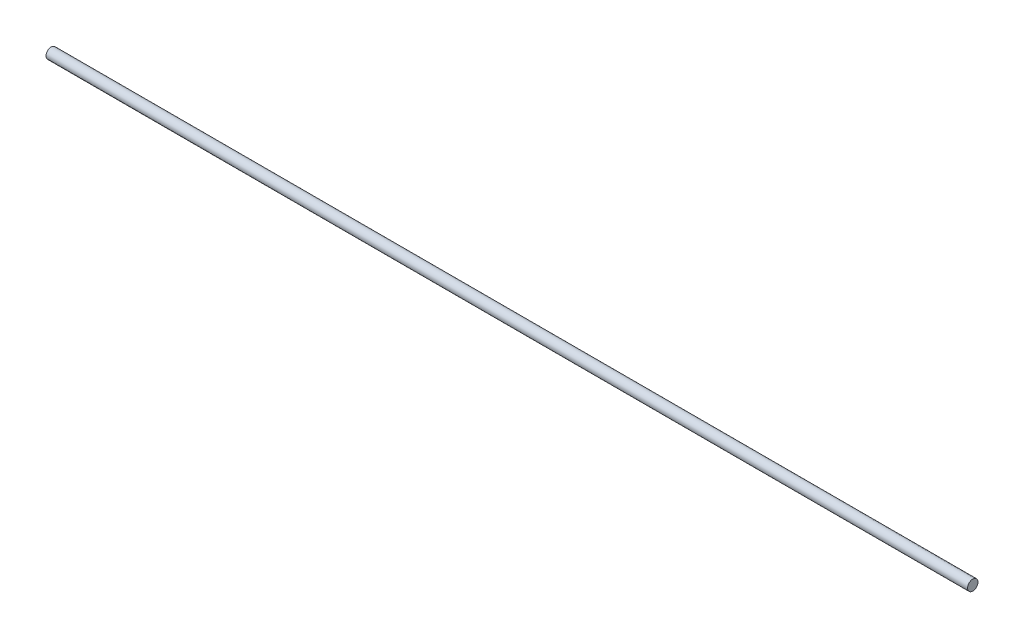
ISO-10303-21;
HEADER;
FILE_DESCRIPTION(('STEP AP214'),'2;1');
FILE_NAME('part.step','',(''),(''),'','','');
FILE_SCHEMA(('AUTOMOTIVE_DESIGN { 1 0 10303 214 1 1 1 1 }'));
ENDSEC;
DATA;
#1=APPLICATION_CONTEXT('core data for automotive mechanical design processes');
#2=APPLICATION_PROTOCOL_DEFINITION('international standard','automotive_design',2000,#1);
#3=PRODUCT_CONTEXT('',#1,'mechanical');
#4=PRODUCT('Part','Part','',(#3));
#5=PRODUCT_RELATED_PRODUCT_CATEGORY('part','',(#4));
#6=PRODUCT_DEFINITION_FORMATION('','',#4);
#7=PRODUCT_DEFINITION_CONTEXT('part definition',#1,'design');
#8=PRODUCT_DEFINITION('design','',#6,#7);
#9=PRODUCT_DEFINITION_SHAPE('','',#8);
#10=(LENGTH_UNIT() NAMED_UNIT(*) SI_UNIT(.MILLI.,.METRE.));
#11=(NAMED_UNIT(*) PLANE_ANGLE_UNIT() SI_UNIT($,.RADIAN.));
#12=(NAMED_UNIT(*) SI_UNIT($,.STERADIAN.) SOLID_ANGLE_UNIT());
#13=UNCERTAINTY_MEASURE_WITH_UNIT(LENGTH_MEASURE(1.E-05),#10,'distance_accuracy_value','');
#14=(GEOMETRIC_REPRESENTATION_CONTEXT(3) GLOBAL_UNCERTAINTY_ASSIGNED_CONTEXT((#13)) GLOBAL_UNIT_ASSIGNED_CONTEXT((#10,
#11,#12)) REPRESENTATION_CONTEXT('',''));
#15=CARTESIAN_POINT('',(0.,0.,0.));
#16=DIRECTION('',(0.,0.,1.));
#17=DIRECTION('',(1.,0.,0.));
#18=AXIS2_PLACEMENT_3D('',#15,#16,#17);
#19=CARTESIAN_POINT('',(1122.172,0.,0.));
#20=DIRECTION('',(-1.,0.,0.));
#21=DIRECTION('',(0.,0.,1.));
#22=AXIS2_PLACEMENT_3D('',#19,#20,#21);
#23=CYLINDRICAL_SURFACE('',#22,6.35);
#24=CARTESIAN_POINT('',(1122.172,0.,0.));
#25=DIRECTION('',(1.,0.,0.));
#26=DIRECTION('',(0.,0.,-1.));
#27=AXIS2_PLACEMENT_3D('',#24,#25,#26);
#28=CIRCLE('',#27,6.35);
#29=CARTESIAN_POINT('',(1122.172,0.,-6.35));
#30=VERTEX_POINT('',#29);
#31=EDGE_CURVE('E10',#30,#30,#28,.T.);
#32=ORIENTED_EDGE('',*,*,#31,.F.);
#33=EDGE_LOOP('',(#32));
#34=FACE_BOUND('',#33,.T.);
#35=CARTESIAN_POINT('',(0.,0.,0.));
#36=DIRECTION('',(1.,0.,0.));
#37=DIRECTION('',(0.,0.,-1.));
#38=AXIS2_PLACEMENT_3D('',#35,#36,#37);
#39=CIRCLE('',#38,6.35);
#40=CARTESIAN_POINT('',(0.,0.,-6.35));
#41=VERTEX_POINT('',#40);
#42=EDGE_CURVE('E46',#41,#41,#39,.T.);
#43=ORIENTED_EDGE('',*,*,#42,.T.);
#44=EDGE_LOOP('',(#43));
#45=FACE_BOUND('',#44,.T.);
#46=ADVANCED_FACE('F43',(#34,#45),#23,.T.);
#47=CARTESIAN_POINT('',(1122.172,0.,0.));
#48=DIRECTION('',(1.,0.,0.));
#49=DIRECTION('',(0.,0.,-1.));
#50=AXIS2_PLACEMENT_3D('',#47,#48,#49);
#51=PLANE('',#50);
#52=ORIENTED_EDGE('',*,*,#31,.T.);
#53=EDGE_LOOP('',(#52));
#54=FACE_BOUND('',#53,.T.);
#55=ADVANCED_FACE('F59',(#54),#51,.T.);
#56=CARTESIAN_POINT('',(0.,0.,0.));
#57=DIRECTION('',(1.,0.,0.));
#58=DIRECTION('',(0.,0.,-1.));
#59=AXIS2_PLACEMENT_3D('',#56,#57,#58);
#60=PLANE('',#59);
#61=ORIENTED_EDGE('',*,*,#42,.F.);
#62=EDGE_LOOP('',(#61));
#63=FACE_BOUND('',#62,.T.);
#64=ADVANCED_FACE('F57',(#63),#60,.F.);
#65=CLOSED_SHELL('',(#46,#55,#64));
#66=MANIFOLD_SOLID_BREP('B2',#65);
#67=ADVANCED_BREP_SHAPE_REPRESENTATION('',(#18,#66),#14);
#68=SHAPE_DEFINITION_REPRESENTATION(#9,#67);
ENDSEC;
END-ISO-10303-21;
